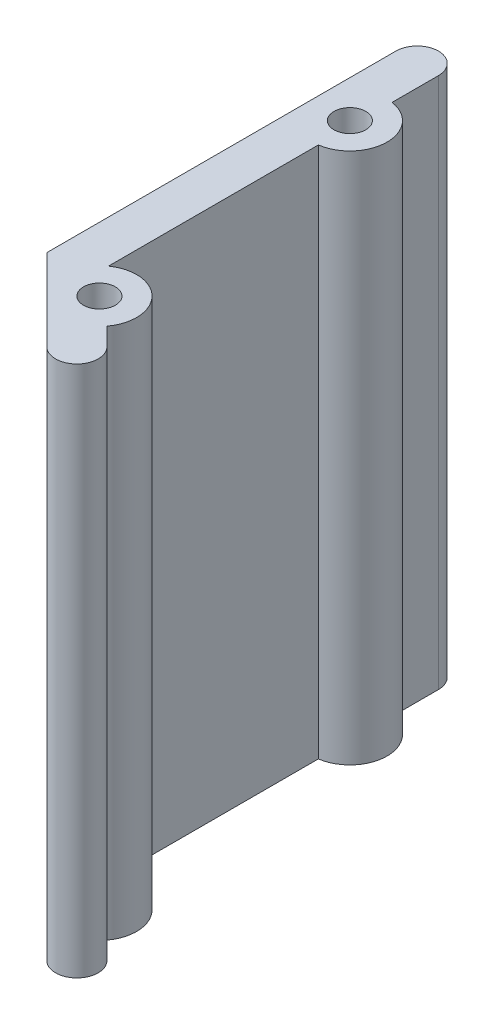
ISO-10303-21;
HEADER;
FILE_DESCRIPTION(('STEP AP214'),'2;1');
FILE_NAME('part.step','',(''),(''),'','','');
FILE_SCHEMA(('AUTOMOTIVE_DESIGN { 1 0 10303 214 1 1 1 1 }'));
ENDSEC;
DATA;
#1=APPLICATION_CONTEXT('core data for automotive mechanical design processes');
#2=APPLICATION_PROTOCOL_DEFINITION('international standard','automotive_design',2000,#1);
#3=PRODUCT_CONTEXT('',#1,'mechanical');
#4=PRODUCT('Part','Part','',(#3));
#5=PRODUCT_RELATED_PRODUCT_CATEGORY('part','',(#4));
#6=PRODUCT_DEFINITION_FORMATION('','',#4);
#7=PRODUCT_DEFINITION_CONTEXT('part definition',#1,'design');
#8=PRODUCT_DEFINITION('design','',#6,#7);
#9=PRODUCT_DEFINITION_SHAPE('','',#8);
#10=(LENGTH_UNIT() NAMED_UNIT(*) SI_UNIT(.MILLI.,.METRE.));
#11=(NAMED_UNIT(*) PLANE_ANGLE_UNIT() SI_UNIT($,.RADIAN.));
#12=(NAMED_UNIT(*) SI_UNIT($,.STERADIAN.) SOLID_ANGLE_UNIT());
#13=UNCERTAINTY_MEASURE_WITH_UNIT(LENGTH_MEASURE(1.E-05),#10,'distance_accuracy_value','');
#14=(GEOMETRIC_REPRESENTATION_CONTEXT(3) GLOBAL_UNCERTAINTY_ASSIGNED_CONTEXT((#13)) GLOBAL_UNIT_ASSIGNED_CONTEXT((#10,
#11,#12)) REPRESENTATION_CONTEXT('',''));
#15=CARTESIAN_POINT('',(0.,0.,0.));
#16=DIRECTION('',(0.,0.,1.));
#17=DIRECTION('',(1.,0.,0.));
#18=AXIS2_PLACEMENT_3D('',#15,#16,#17);
#19=CARTESIAN_POINT('',(2.,50.,-0.828427124746187));
#20=DIRECTION('',(-0.707106781186547,0.,0.707106781186548));
#21=DIRECTION('',(0.707106781186548,0.,0.707106781186547));
#22=AXIS2_PLACEMENT_3D('',#19,#20,#21);
#23=PLANE('',#22);
#24=DIRECTION('',(-0.707106781186548,0.,-0.707106781186547));
#25=VECTOR('',#24,1.);
#26=CARTESIAN_POINT('',(2.,40.,-0.828427124746187));
#27=LINE('',#26,#25);
#28=CARTESIAN_POINT('',(5.36396103067893,40.,2.53553390593274));
#29=VERTEX_POINT('',#28);
#30=CARTESIAN_POINT('',(3.36396103067893,40.,0.535533905932741));
#31=VERTEX_POINT('',#30);
#32=EDGE_CURVE('E144',#29,#31,#27,.T.);
#33=ORIENTED_EDGE('',*,*,#32,.F.);
#34=DIRECTION('',(0.,-1.,0.));
#35=VECTOR('',#34,1.);
#36=CARTESIAN_POINT('',(5.36396103067893,50.,2.53553390593274));
#37=LINE('',#36,#35);
#38=CARTESIAN_POINT('',(5.36396103067893,10.,2.53553390593274));
#39=VERTEX_POINT('',#38);
#40=EDGE_CURVE('E153',#39,#29,#37,.F.);
#41=ORIENTED_EDGE('',*,*,#40,.F.);
#42=DIRECTION('',(0.707106781186548,0.,0.707106781186547));
#43=VECTOR('',#42,1.);
#44=CARTESIAN_POINT('',(2.,10.,-0.828427124746187));
#45=LINE('',#44,#43);
#46=CARTESIAN_POINT('',(3.36396103067893,10.,0.535533905932741));
#47=VERTEX_POINT('',#46);
#48=EDGE_CURVE('E261',#47,#39,#45,.T.);
#49=ORIENTED_EDGE('',*,*,#48,.F.);
#50=DIRECTION('',(0.,-1.,0.));
#51=VECTOR('',#50,1.);
#52=CARTESIAN_POINT('',(3.36396103067893,50.,0.535533905932742));
#53=LINE('',#52,#51);
#54=EDGE_CURVE('E154',#31,#47,#53,.T.);
#55=ORIENTED_EDGE('',*,*,#54,.F.);
#56=EDGE_LOOP('',(#33,#41,#49,#55));
#57=FACE_BOUND('',#56,.T.);
#58=ADVANCED_FACE('F45',(#57),#23,.F.);
#59=CARTESIAN_POINT('',(2.,50.,-32.));
#60=DIRECTION('',(-1.,0.,0.));
#61=DIRECTION('',(0.,0.,1.));
#62=AXIS2_PLACEMENT_3D('',#59,#60,#61);
#63=PLANE('',#62);
#64=DIRECTION('',(0.,0.,-1.));
#65=VECTOR('',#64,1.);
#66=CARTESIAN_POINT('',(2.,40.,-32.));
#67=LINE('',#66,#65);
#68=CARTESIAN_POINT('',(2.,40.,-22.7573593128807));
#69=VERTEX_POINT('',#68);
#70=CARTESIAN_POINT('',(2.,40.,-25.5857864376269));
#71=VERTEX_POINT('',#70);
#72=EDGE_CURVE('E155',#69,#71,#67,.T.);
#73=ORIENTED_EDGE('',*,*,#72,.F.);
#74=DIRECTION('',(0.,-1.,0.));
#75=VECTOR('',#74,1.);
#76=CARTESIAN_POINT('',(2.,50.,-22.7573593128807));
#77=LINE('',#76,#75);
#78=CARTESIAN_POINT('',(2.,10.,-22.7573593128807));
#79=VERTEX_POINT('',#78);
#80=EDGE_CURVE('E183',#79,#69,#77,.F.);
#81=ORIENTED_EDGE('',*,*,#80,.F.);
#82=DIRECTION('',(0.,0.,1.));
#83=VECTOR('',#82,1.);
#84=CARTESIAN_POINT('',(2.,10.,-32.));
#85=LINE('',#84,#83);
#86=CARTESIAN_POINT('',(2.,10.,-25.5857864376269));
#87=VERTEX_POINT('',#86);
#88=EDGE_CURVE('E258',#87,#79,#85,.T.);
#89=ORIENTED_EDGE('',*,*,#88,.F.);
#90=DIRECTION('',(0.,-1.,0.));
#91=VECTOR('',#90,1.);
#92=CARTESIAN_POINT('',(2.,50.,-25.5857864376269));
#93=LINE('',#92,#91);
#94=EDGE_CURVE('E188',#71,#87,#93,.T.);
#95=ORIENTED_EDGE('',*,*,#94,.F.);
#96=EDGE_LOOP('',(#73,#81,#89,#95));
#97=FACE_BOUND('',#96,.T.);
#98=ADVANCED_FACE('F278',(#97),#63,.F.);
#99=DIRECTION('',(0.,0.,-1.));
#100=VECTOR('',#99,1.);
#101=CARTESIAN_POINT('',(2.,50.,-32.));
#102=LINE('',#101,#100);
#103=CARTESIAN_POINT('',(2.,50.,-27.6356744903916));
#104=VERTEX_POINT('',#103);
#105=CARTESIAN_POINT('',(2.,50.,-32.));
#106=VERTEX_POINT('',#105);
#107=EDGE_CURVE('E207',#104,#106,#102,.T.);
#108=ORIENTED_EDGE('',*,*,#107,.F.);
#109=DIRECTION('',(0.,-1.,0.));
#110=VECTOR('',#109,1.);
#111=CARTESIAN_POINT('',(2.,50.,-27.6356744903916));
#112=LINE('',#111,#110);
#113=CARTESIAN_POINT('',(2.,0.,-27.6356744903916));
#114=VERTEX_POINT('',#113);
#115=EDGE_CURVE('E192',#104,#114,#112,.T.);
#116=ORIENTED_EDGE('',*,*,#115,.T.);
#117=DIRECTION('',(0.,0.,-1.));
#118=VECTOR('',#117,1.);
#119=CARTESIAN_POINT('',(2.,0.,-32.));
#120=LINE('',#119,#118);
#121=CARTESIAN_POINT('',(2.,0.,-32.));
#122=VERTEX_POINT('',#121);
#123=EDGE_CURVE('E220',#114,#122,#120,.T.);
#124=ORIENTED_EDGE('',*,*,#123,.T.);
#125=DIRECTION('',(0.,-1.,0.));
#126=VECTOR('',#125,1.);
#127=CARTESIAN_POINT('',(2.,50.,-32.));
#128=LINE('',#127,#126);
#129=EDGE_CURVE('E209',#106,#122,#128,.T.);
#130=ORIENTED_EDGE('',*,*,#129,.F.);
#131=EDGE_LOOP('',(#108,#116,#124,#130));
#132=FACE_BOUND('',#131,.T.);
#133=ADVANCED_FACE('F302',(#132),#63,.F.);
#134=CARTESIAN_POINT('',(0.,50.,-32.));
#135=DIRECTION('',(0.,-1.,0.));
#136=DIRECTION('',(0.,0.,-1.));
#137=AXIS2_PLACEMENT_3D('',#134,#135,#136);
#138=CYLINDRICAL_SURFACE('',#137,2.);
#139=CARTESIAN_POINT('',(0.,0.,-32.));
#140=DIRECTION('',(0.,1.,0.));
#141=DIRECTION('',(0.,0.,-1.));
#142=AXIS2_PLACEMENT_3D('',#139,#140,#141);
#143=CIRCLE('',#142,2.);
#144=CARTESIAN_POINT('',(-2.,0.,-32.));
#145=VERTEX_POINT('',#144);
#146=EDGE_CURVE('E194',#122,#145,#143,.T.);
#147=ORIENTED_EDGE('',*,*,#146,.T.);
#148=DIRECTION('',(0.,-1.,0.));
#149=VECTOR('',#148,1.);
#150=CARTESIAN_POINT('',(-2.,50.,-32.));
#151=LINE('',#150,#149);
#152=CARTESIAN_POINT('',(-2.,50.,-32.));
#153=VERTEX_POINT('',#152);
#154=EDGE_CURVE('E12',#153,#145,#151,.T.);
#155=ORIENTED_EDGE('',*,*,#154,.F.);
#156=CARTESIAN_POINT('',(0.,50.,-32.));
#157=DIRECTION('',(0.,1.,0.));
#158=DIRECTION('',(0.,0.,-1.));
#159=AXIS2_PLACEMENT_3D('',#156,#157,#158);
#160=CIRCLE('',#159,2.);
#161=EDGE_CURVE('E195',#106,#153,#160,.T.);
#162=ORIENTED_EDGE('',*,*,#161,.F.);
#163=ORIENTED_EDGE('',*,*,#129,.T.);
#164=EDGE_LOOP('',(#147,#155,#162,#163));
#165=FACE_BOUND('',#164,.T.);
#166=ADVANCED_FACE('F47',(#165),#138,.T.);
#167=CARTESIAN_POINT('',(-2.,50.,-32.));
#168=DIRECTION('',(1.,0.,0.));
#169=DIRECTION('',(0.,0.,-1.));
#170=AXIS2_PLACEMENT_3D('',#167,#168,#169);
#171=PLANE('',#170);
#172=DIRECTION('',(0.,-1.,0.));
#173=VECTOR('',#172,1.);
#174=CARTESIAN_POINT('',(-2.,50.,0.828427124746195));
#175=LINE('',#174,#173);
#176=CARTESIAN_POINT('',(-2.,50.,0.828427124746195));
#177=VERTEX_POINT('',#176);
#178=CARTESIAN_POINT('',(-2.,0.,0.828427124746195));
#179=VERTEX_POINT('',#178);
#180=EDGE_CURVE('E53',#177,#179,#175,.T.);
#181=ORIENTED_EDGE('',*,*,#180,.F.);
#182=DIRECTION('',(0.,0.,1.));
#183=VECTOR('',#182,1.);
#184=CARTESIAN_POINT('',(-2.,50.,-32.));
#185=LINE('',#184,#183);
#186=EDGE_CURVE('E198',#153,#177,#185,.T.);
#187=ORIENTED_EDGE('',*,*,#186,.F.);
#188=ORIENTED_EDGE('',*,*,#154,.T.);
#189=DIRECTION('',(0.,0.,1.));
#190=VECTOR('',#189,1.);
#191=CARTESIAN_POINT('',(-2.,0.,-32.));
#192=LINE('',#191,#190);
#193=EDGE_CURVE('E212',#145,#179,#192,.T.);
#194=ORIENTED_EDGE('',*,*,#193,.T.);
#195=EDGE_LOOP('',(#181,#187,#188,#194));
#196=FACE_BOUND('',#195,.T.);
#197=ADVANCED_FACE('F314',(#196),#171,.F.);
#198=CARTESIAN_POINT('',(-2.,50.,0.828427124746195));
#199=DIRECTION('',(0.707106781186547,0.,-0.707106781186548));
#200=DIRECTION('',(-0.707106781186548,0.,-0.707106781186547));
#201=AXIS2_PLACEMENT_3D('',#198,#199,#200);
#202=PLANE('',#201);
#203=DIRECTION('',(0.,-1.,0.));
#204=VECTOR('',#203,1.);
#205=CARTESIAN_POINT('',(5.65685424949238,50.,8.48528137423857));
#206=LINE('',#205,#204);
#207=CARTESIAN_POINT('',(5.65685424949238,50.,8.48528137423857));
#208=VERTEX_POINT('',#207);
#209=CARTESIAN_POINT('',(5.65685424949238,0.,8.48528137423857));
#210=VERTEX_POINT('',#209);
#211=EDGE_CURVE('E227',#208,#210,#206,.T.);
#212=ORIENTED_EDGE('',*,*,#211,.F.);
#213=DIRECTION('',(0.707106781186548,0.,0.707106781186547));
#214=VECTOR('',#213,1.);
#215=CARTESIAN_POINT('',(-2.,50.,0.828427124746195));
#216=LINE('',#215,#214);
#217=EDGE_CURVE('E201',#177,#208,#216,.T.);
#218=ORIENTED_EDGE('',*,*,#217,.F.);
#219=ORIENTED_EDGE('',*,*,#180,.T.);
#220=DIRECTION('',(0.707106781186548,0.,0.707106781186547));
#221=VECTOR('',#220,1.);
#222=CARTESIAN_POINT('',(-2.,0.,0.828427124746195));
#223=LINE('',#222,#221);
#224=EDGE_CURVE('E214',#179,#210,#223,.T.);
#225=ORIENTED_EDGE('',*,*,#224,.T.);
#226=EDGE_LOOP('',(#212,#218,#219,#225));
#227=FACE_BOUND('',#226,.T.);
#228=ADVANCED_FACE('F235',(#227),#202,.F.);
#229=CARTESIAN_POINT('',(7.07106781186547,50.,7.07106781186547));
#230=DIRECTION('',(0.,-1.,0.));
#231=DIRECTION('',(0.,0.,-1.));
#232=AXIS2_PLACEMENT_3D('',#229,#230,#231);
#233=CYLINDRICAL_SURFACE('',#232,2.);
#234=CARTESIAN_POINT('',(7.07106781186547,0.,7.07106781186547));
#235=DIRECTION('',(0.,1.,0.));
#236=DIRECTION('',(0.,0.,1.));
#237=AXIS2_PLACEMENT_3D('',#234,#235,#236);
#238=CIRCLE('',#237,2.);
#239=CARTESIAN_POINT('',(8.48528137423857,0.,5.65685424949238));
#240=VERTEX_POINT('',#239);
#241=EDGE_CURVE('E216',#210,#240,#238,.T.);
#242=ORIENTED_EDGE('',*,*,#241,.T.);
#243=DIRECTION('',(0.,-1.,0.));
#244=VECTOR('',#243,1.);
#245=CARTESIAN_POINT('',(8.48528137423857,50.,5.65685424949238));
#246=LINE('',#245,#244);
#247=CARTESIAN_POINT('',(8.48528137423857,50.,5.65685424949238));
#248=VERTEX_POINT('',#247);
#249=EDGE_CURVE('E224',#248,#240,#246,.T.);
#250=ORIENTED_EDGE('',*,*,#249,.F.);
#251=CARTESIAN_POINT('',(7.07106781186547,50.,7.07106781186547));
#252=DIRECTION('',(0.,1.,0.));
#253=DIRECTION('',(0.,0.,1.));
#254=AXIS2_PLACEMENT_3D('',#251,#252,#253);
#255=CIRCLE('',#254,2.);
#256=EDGE_CURVE('E203',#208,#248,#255,.T.);
#257=ORIENTED_EDGE('',*,*,#256,.F.);
#258=ORIENTED_EDGE('',*,*,#211,.T.);
#259=EDGE_LOOP('',(#242,#250,#257,#258));
#260=FACE_BOUND('',#259,.T.);
#261=ADVANCED_FACE('F245',(#260),#233,.T.);
#262=DIRECTION('',(-0.707106781186548,0.,-0.707106781186547));
#263=VECTOR('',#262,1.);
#264=CARTESIAN_POINT('',(2.,0.,-0.828427124746187));
#265=LINE('',#264,#263);
#266=CARTESIAN_POINT('',(6.81345077346211,0.,3.98502364871592));
#267=VERTEX_POINT('',#266);
#268=EDGE_CURVE('E218',#240,#267,#265,.T.);
#269=ORIENTED_EDGE('',*,*,#268,.T.);
#270=DIRECTION('',(0.,-1.,0.));
#271=VECTOR('',#270,1.);
#272=CARTESIAN_POINT('',(6.81345077346211,50.,3.98502364871592));
#273=LINE('',#272,#271);
#274=CARTESIAN_POINT('',(6.81345077346211,50.,3.98502364871592));
#275=VERTEX_POINT('',#274);
#276=EDGE_CURVE('E68',#267,#275,#273,.F.);
#277=ORIENTED_EDGE('',*,*,#276,.T.);
#278=DIRECTION('',(-0.707106781186548,0.,-0.707106781186547));
#279=VECTOR('',#278,1.);
#280=CARTESIAN_POINT('',(2.,50.,-0.828427124746187));
#281=LINE('',#280,#279);
#282=EDGE_CURVE('E205',#248,#275,#281,.T.);
#283=ORIENTED_EDGE('',*,*,#282,.F.);
#284=ORIENTED_EDGE('',*,*,#249,.T.);
#285=EDGE_LOOP('',(#269,#277,#283,#284));
#286=FACE_BOUND('',#285,.T.);
#287=ADVANCED_FACE('F247',(#286),#23,.F.);
#288=CARTESIAN_POINT('',(2.,50.,-0.975919007251557));
#289=VERTEX_POINT('',#288);
#290=CARTESIAN_POINT('',(2.,50.,-20.707471260116));
#291=VERTEX_POINT('',#290);
#292=EDGE_CURVE('E60',#289,#291,#102,.T.);
#293=ORIENTED_EDGE('',*,*,#292,.F.);
#294=DIRECTION('',(0.,-1.,0.));
#295=VECTOR('',#294,1.);
#296=CARTESIAN_POINT('',(2.,50.,-0.975919007251557));
#297=LINE('',#296,#295);
#298=CARTESIAN_POINT('',(2.,0.,-0.975919007251557));
#299=VERTEX_POINT('',#298);
#300=EDGE_CURVE('E164',#289,#299,#297,.T.);
#301=ORIENTED_EDGE('',*,*,#300,.T.);
#302=CARTESIAN_POINT('',(2.,0.,-20.707471260116));
#303=VERTEX_POINT('',#302);
#304=EDGE_CURVE('E199',#299,#303,#120,.T.);
#305=ORIENTED_EDGE('',*,*,#304,.T.);
#306=DIRECTION('',(0.,-1.,0.));
#307=VECTOR('',#306,1.);
#308=CARTESIAN_POINT('',(2.,50.,-20.707471260116));
#309=LINE('',#308,#307);
#310=EDGE_CURVE('E190',#303,#291,#309,.F.);
#311=ORIENTED_EDGE('',*,*,#310,.T.);
#312=EDGE_LOOP('',(#293,#301,#305,#311));
#313=FACE_BOUND('',#312,.T.);
#314=ADVANCED_FACE('F304',(#313),#63,.F.);
#315=CARTESIAN_POINT('',(0.,50.,-32.));
#316=DIRECTION('',(0.,-1.,0.));
#317=DIRECTION('',(0.,0.,-1.));
#318=AXIS2_PLACEMENT_3D('',#315,#316,#317);
#319=PLANE('',#318);
#320=CARTESIAN_POINT('',(4.01040764008566,50.,1.88908729652602));
#321=DIRECTION('',(0.,-1.,0.));
#322=DIRECTION('',(0.,0.,-1.));
#323=AXIS2_PLACEMENT_3D('',#320,#321,#322);
#324=CIRCLE('',#323,1.5);
#325=CARTESIAN_POINT('',(4.01040764008566,50.,0.389087296526016));
#326=VERTEX_POINT('',#325);
#327=EDGE_CURVE('E167',#326,#326,#324,.T.);
#328=ORIENTED_EDGE('',*,*,#327,.T.);
#329=EDGE_LOOP('',(#328));
#330=FACE_BOUND('',#329,.T.);
#331=ORIENTED_EDGE('',*,*,#217,.T.);
#332=ORIENTED_EDGE('',*,*,#256,.T.);
#333=ORIENTED_EDGE('',*,*,#282,.T.);
#334=CARTESIAN_POINT('',(4.01040764008566,50.,1.88908729652602));
#335=DIRECTION('',(0.,-1.,0.));
#336=DIRECTION('',(0.,0.,-1.));
#337=AXIS2_PLACEMENT_3D('',#334,#335,#336);
#338=CIRCLE('',#337,3.5);
#339=EDGE_CURVE('E253',#289,#275,#338,.T.);
#340=ORIENTED_EDGE('',*,*,#339,.F.);
#341=ORIENTED_EDGE('',*,*,#292,.T.);
#342=CARTESIAN_POINT('',(1.5,50.,-24.1715728752538));
#343=DIRECTION('',(0.,-1.,0.));
#344=DIRECTION('',(0.,0.,-1.));
#345=AXIS2_PLACEMENT_3D('',#342,#343,#344);
#346=CIRCLE('',#345,3.5);
#347=EDGE_CURVE('E180',#104,#291,#346,.T.);
#348=ORIENTED_EDGE('',*,*,#347,.F.);
#349=ORIENTED_EDGE('',*,*,#107,.T.);
#350=ORIENTED_EDGE('',*,*,#161,.T.);
#351=ORIENTED_EDGE('',*,*,#186,.T.);
#352=EDGE_LOOP('',(#331,#332,#333,#340,#341,#348,#349,#350,#351));
#353=FACE_BOUND('',#352,.T.);
#354=CARTESIAN_POINT('',(1.5,50.,-24.1715728752538));
#355=DIRECTION('',(0.,-1.,0.));
#356=DIRECTION('',(0.,0.,-1.));
#357=AXIS2_PLACEMENT_3D('',#354,#355,#356);
#358=CIRCLE('',#357,1.5);
#359=CARTESIAN_POINT('',(1.5,50.,-25.6715728752538));
#360=VERTEX_POINT('',#359);
#361=EDGE_CURVE('E174',#360,#360,#358,.T.);
#362=ORIENTED_EDGE('',*,*,#361,.T.);
#363=EDGE_LOOP('',(#362));
#364=FACE_BOUND('',#363,.T.);
#365=ADVANCED_FACE('F251',(#330,#353,#364),#319,.F.);
#366=CARTESIAN_POINT('',(0.,0.,-32.));
#367=DIRECTION('',(0.,-1.,0.));
#368=DIRECTION('',(0.,0.,-1.));
#369=AXIS2_PLACEMENT_3D('',#366,#367,#368);
#370=PLANE('',#369);
#371=CARTESIAN_POINT('',(4.01040764008566,0.,1.88908729652602));
#372=DIRECTION('',(0.,-1.,0.));
#373=DIRECTION('',(0.,0.,-1.));
#374=AXIS2_PLACEMENT_3D('',#371,#372,#373);
#375=CIRCLE('',#374,1.5);
#376=CARTESIAN_POINT('',(4.01040764008566,0.,0.389087296526016));
#377=VERTEX_POINT('',#376);
#378=EDGE_CURVE('E162',#377,#377,#375,.T.);
#379=ORIENTED_EDGE('',*,*,#378,.F.);
#380=EDGE_LOOP('',(#379));
#381=FACE_BOUND('',#380,.T.);
#382=CARTESIAN_POINT('',(1.5,0.,-24.1715728752538));
#383=DIRECTION('',(0.,-1.,0.));
#384=DIRECTION('',(0.,0.,-1.));
#385=AXIS2_PLACEMENT_3D('',#382,#383,#384);
#386=CIRCLE('',#385,1.5);
#387=CARTESIAN_POINT('',(1.5,0.,-25.6715728752538));
#388=VERTEX_POINT('',#387);
#389=EDGE_CURVE('E173',#388,#388,#386,.T.);
#390=ORIENTED_EDGE('',*,*,#389,.F.);
#391=EDGE_LOOP('',(#390));
#392=FACE_BOUND('',#391,.T.);
#393=ORIENTED_EDGE('',*,*,#304,.F.);
#394=CARTESIAN_POINT('',(4.01040764008566,0.,1.88908729652602));
#395=DIRECTION('',(0.,-1.,0.));
#396=DIRECTION('',(0.,0.,-1.));
#397=AXIS2_PLACEMENT_3D('',#394,#395,#396);
#398=CIRCLE('',#397,3.5);
#399=EDGE_CURVE('E257',#299,#267,#398,.T.);
#400=ORIENTED_EDGE('',*,*,#399,.T.);
#401=ORIENTED_EDGE('',*,*,#268,.F.);
#402=ORIENTED_EDGE('',*,*,#241,.F.);
#403=ORIENTED_EDGE('',*,*,#224,.F.);
#404=ORIENTED_EDGE('',*,*,#193,.F.);
#405=ORIENTED_EDGE('',*,*,#146,.F.);
#406=ORIENTED_EDGE('',*,*,#123,.F.);
#407=CARTESIAN_POINT('',(1.5,0.,-24.1715728752538));
#408=DIRECTION('',(0.,-1.,0.));
#409=DIRECTION('',(0.,0.,-1.));
#410=AXIS2_PLACEMENT_3D('',#407,#408,#409);
#411=CIRCLE('',#410,3.5);
#412=EDGE_CURVE('E177',#114,#303,#411,.T.);
#413=ORIENTED_EDGE('',*,*,#412,.T.);
#414=EDGE_LOOP('',(#393,#400,#401,#402,#403,#404,#405,#406,#413));
#415=FACE_BOUND('',#414,.T.);
#416=ADVANCED_FACE('F239',(#381,#392,#415),#370,.T.);
#417=CARTESIAN_POINT('',(1.5,50.,-24.1715728752538));
#418=DIRECTION('',(0.,-1.,0.));
#419=DIRECTION('',(0.,0.,-1.));
#420=AXIS2_PLACEMENT_3D('',#417,#418,#419);
#421=CYLINDRICAL_SURFACE('',#420,3.5);
#422=ORIENTED_EDGE('',*,*,#115,.F.);
#423=ORIENTED_EDGE('',*,*,#347,.T.);
#424=ORIENTED_EDGE('',*,*,#310,.F.);
#425=ORIENTED_EDGE('',*,*,#412,.F.);
#426=EDGE_LOOP('',(#422,#423,#424,#425));
#427=FACE_BOUND('',#426,.T.);
#428=ADVANCED_FACE('F333',(#427),#421,.T.);
#429=CARTESIAN_POINT('',(1.5,50.,-24.1715728752538));
#430=DIRECTION('',(0.,-1.,0.));
#431=DIRECTION('',(0.,0.,-1.));
#432=AXIS2_PLACEMENT_3D('',#429,#430,#431);
#433=CYLINDRICAL_SURFACE('',#432,1.5);
#434=ORIENTED_EDGE('',*,*,#361,.F.);
#435=EDGE_LOOP('',(#434));
#436=FACE_BOUND('',#435,.T.);
#437=ORIENTED_EDGE('',*,*,#80,.T.);
#438=CARTESIAN_POINT('',(1.5,40.,-24.1715728752538));
#439=DIRECTION('',(0.,1.,0.));
#440=DIRECTION('',(0.,0.,1.));
#441=AXIS2_PLACEMENT_3D('',#438,#439,#440);
#442=CIRCLE('',#441,1.5);
#443=EDGE_CURVE('E148',#71,#69,#442,.T.);
#444=ORIENTED_EDGE('',*,*,#443,.F.);
#445=ORIENTED_EDGE('',*,*,#94,.T.);
#446=CARTESIAN_POINT('',(1.5,10.,-24.1715728752538));
#447=DIRECTION('',(0.,-1.,0.));
#448=DIRECTION('',(0.,0.,-1.));
#449=AXIS2_PLACEMENT_3D('',#446,#447,#448);
#450=CIRCLE('',#449,1.5);
#451=EDGE_CURVE('E265',#79,#87,#450,.T.);
#452=ORIENTED_EDGE('',*,*,#451,.F.);
#453=EDGE_LOOP('',(#437,#444,#445,#452));
#454=FACE_BOUND('',#453,.T.);
#455=ORIENTED_EDGE('',*,*,#389,.T.);
#456=EDGE_LOOP('',(#455));
#457=FACE_BOUND('',#456,.T.);
#458=ADVANCED_FACE('F281',(#436,#454,#457),#433,.F.);
#459=CARTESIAN_POINT('',(4.01040764008566,50.,1.88908729652602));
#460=DIRECTION('',(0.,-1.,0.));
#461=DIRECTION('',(0.,0.,-1.));
#462=AXIS2_PLACEMENT_3D('',#459,#460,#461);
#463=CYLINDRICAL_SURFACE('',#462,3.5);
#464=ORIENTED_EDGE('',*,*,#276,.F.);
#465=ORIENTED_EDGE('',*,*,#399,.F.);
#466=ORIENTED_EDGE('',*,*,#300,.F.);
#467=ORIENTED_EDGE('',*,*,#339,.T.);
#468=EDGE_LOOP('',(#464,#465,#466,#467));
#469=FACE_BOUND('',#468,.T.);
#470=ADVANCED_FACE('F255',(#469),#463,.T.);
#471=CARTESIAN_POINT('',(4.01040764008566,50.,1.88908729652602));
#472=DIRECTION('',(0.,-1.,0.));
#473=DIRECTION('',(0.,0.,-1.));
#474=AXIS2_PLACEMENT_3D('',#471,#472,#473);
#475=CYLINDRICAL_SURFACE('',#474,1.5);
#476=ORIENTED_EDGE('',*,*,#327,.F.);
#477=EDGE_LOOP('',(#476));
#478=FACE_BOUND('',#477,.T.);
#479=ORIENTED_EDGE('',*,*,#40,.T.);
#480=CARTESIAN_POINT('',(4.01040764008566,40.,1.88908729652602));
#481=DIRECTION('',(0.,1.,0.));
#482=DIRECTION('',(0.,0.,1.));
#483=AXIS2_PLACEMENT_3D('',#480,#481,#482);
#484=CIRCLE('',#483,1.5);
#485=EDGE_CURVE('E141',#31,#29,#484,.T.);
#486=ORIENTED_EDGE('',*,*,#485,.F.);
#487=ORIENTED_EDGE('',*,*,#54,.T.);
#488=CARTESIAN_POINT('',(4.01040764008566,10.,1.88908729652602));
#489=DIRECTION('',(0.,-1.,0.));
#490=DIRECTION('',(0.,0.,-1.));
#491=AXIS2_PLACEMENT_3D('',#488,#489,#490);
#492=CIRCLE('',#491,1.5);
#493=EDGE_CURVE('E161',#39,#47,#492,.T.);
#494=ORIENTED_EDGE('',*,*,#493,.F.);
#495=EDGE_LOOP('',(#479,#486,#487,#494));
#496=FACE_BOUND('',#495,.T.);
#497=ORIENTED_EDGE('',*,*,#378,.T.);
#498=EDGE_LOOP('',(#497));
#499=FACE_BOUND('',#498,.T.);
#500=ADVANCED_FACE('F158',(#478,#496,#499),#475,.F.);
#501=CARTESIAN_POINT('',(1.5,10.,-24.1715728752538));
#502=DIRECTION('',(0.,-1.,0.));
#503=DIRECTION('',(0.,0.,-1.));
#504=AXIS2_PLACEMENT_3D('',#501,#502,#503);
#505=PLANE('',#504);
#506=ORIENTED_EDGE('',*,*,#88,.T.);
#507=ORIENTED_EDGE('',*,*,#451,.T.);
#508=EDGE_LOOP('',(#506,#507));
#509=FACE_BOUND('',#508,.T.);
#510=ADVANCED_FACE('F284',(#509),#505,.T.);
#511=CARTESIAN_POINT('',(4.01040764008566,10.,1.88908729652602));
#512=DIRECTION('',(0.,-1.,0.));
#513=DIRECTION('',(0.,0.,-1.));
#514=AXIS2_PLACEMENT_3D('',#511,#512,#513);
#515=PLANE('',#514);
#516=ORIENTED_EDGE('',*,*,#48,.T.);
#517=ORIENTED_EDGE('',*,*,#493,.T.);
#518=EDGE_LOOP('',(#516,#517));
#519=FACE_BOUND('',#518,.T.);
#520=ADVANCED_FACE('F286',(#519),#515,.T.);
#521=CARTESIAN_POINT('',(1.5,40.,-24.1715728752538));
#522=DIRECTION('',(0.,1.,0.));
#523=DIRECTION('',(0.,0.,1.));
#524=AXIS2_PLACEMENT_3D('',#521,#522,#523);
#525=PLANE('',#524);
#526=ORIENTED_EDGE('',*,*,#72,.T.);
#527=ORIENTED_EDGE('',*,*,#443,.T.);
#528=EDGE_LOOP('',(#526,#527));
#529=FACE_BOUND('',#528,.T.);
#530=ADVANCED_FACE('F273',(#529),#525,.T.);
#531=CARTESIAN_POINT('',(4.01040764008566,40.,1.88908729652602));
#532=DIRECTION('',(0.,1.,0.));
#533=DIRECTION('',(0.,0.,1.));
#534=AXIS2_PLACEMENT_3D('',#531,#532,#533);
#535=PLANE('',#534);
#536=ORIENTED_EDGE('',*,*,#32,.T.);
#537=ORIENTED_EDGE('',*,*,#485,.T.);
#538=EDGE_LOOP('',(#536,#537));
#539=FACE_BOUND('',#538,.T.);
#540=ADVANCED_FACE('F143',(#539),#535,.T.);
#541=CLOSED_SHELL('',(#58,#98,#133,#166,#197,#228,#261,#287,#314,#365,#416,#428,#458,#470,#500,
#510,#520,#530,#540));
#542=MANIFOLD_SOLID_BREP('B2',#541);
#543=ADVANCED_BREP_SHAPE_REPRESENTATION('',(#18,#542),#14);
#544=SHAPE_DEFINITION_REPRESENTATION(#9,#543);
ENDSEC;
END-ISO-10303-21;
